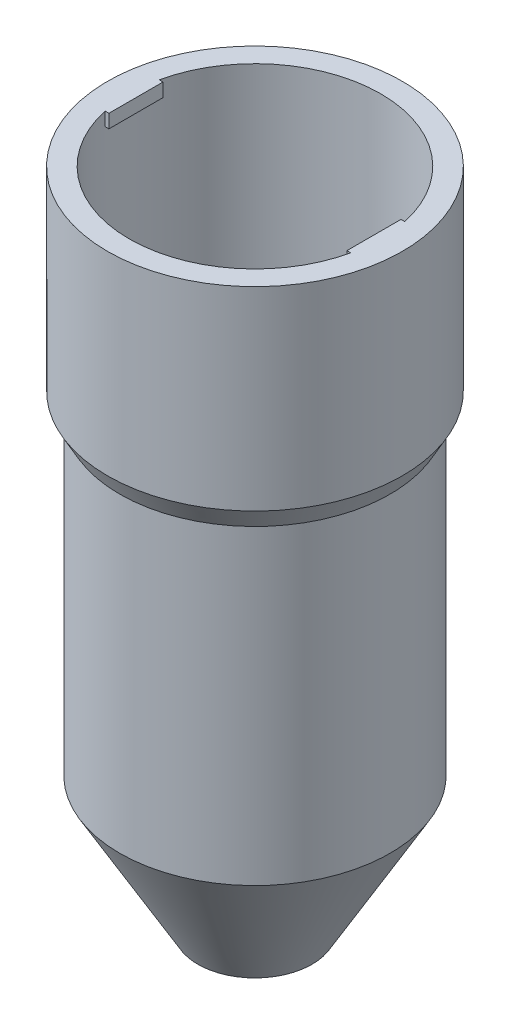
ISO-10303-21;
HEADER;
FILE_DESCRIPTION(('STEP AP214'),'2;1');
FILE_NAME('part.step','',(''),(''),'','','');
FILE_SCHEMA(('AUTOMOTIVE_DESIGN { 1 0 10303 214 1 1 1 1 }'));
ENDSEC;
DATA;
#1=APPLICATION_CONTEXT('core data for automotive mechanical design processes');
#2=APPLICATION_PROTOCOL_DEFINITION('international standard','automotive_design',2000,#1);
#3=PRODUCT_CONTEXT('',#1,'mechanical');
#4=PRODUCT('Part','Part','',(#3));
#5=PRODUCT_RELATED_PRODUCT_CATEGORY('part','',(#4));
#6=PRODUCT_DEFINITION_FORMATION('','',#4);
#7=PRODUCT_DEFINITION_CONTEXT('part definition',#1,'design');
#8=PRODUCT_DEFINITION('design','',#6,#7);
#9=PRODUCT_DEFINITION_SHAPE('','',#8);
#10=(LENGTH_UNIT() NAMED_UNIT(*) SI_UNIT(.MILLI.,.METRE.));
#11=(NAMED_UNIT(*) PLANE_ANGLE_UNIT() SI_UNIT($,.RADIAN.));
#12=(NAMED_UNIT(*) SI_UNIT($,.STERADIAN.) SOLID_ANGLE_UNIT());
#13=UNCERTAINTY_MEASURE_WITH_UNIT(LENGTH_MEASURE(1.E-05),#10,'distance_accuracy_value','');
#14=(GEOMETRIC_REPRESENTATION_CONTEXT(3) GLOBAL_UNCERTAINTY_ASSIGNED_CONTEXT((#13)) GLOBAL_UNIT_ASSIGNED_CONTEXT((#10,
#11,#12)) REPRESENTATION_CONTEXT('',''));
#15=CARTESIAN_POINT('',(0.,0.,0.));
#16=DIRECTION('',(0.,0.,1.));
#17=DIRECTION('',(1.,0.,0.));
#18=AXIS2_PLACEMENT_3D('',#15,#16,#17);
#19=CARTESIAN_POINT('',(0.,16.,0.));
#20=DIRECTION('',(0.,1.,0.));
#21=DIRECTION('',(0.,0.,1.));
#22=AXIS2_PLACEMENT_3D('',#19,#20,#21);
#23=PLANE('',#22);
#24=CARTESIAN_POINT('',(0.,16.,0.));
#25=DIRECTION('',(0.,1.,0.));
#26=DIRECTION('',(0.,0.,1.));
#27=AXIS2_PLACEMENT_3D('',#24,#25,#26);
#28=CIRCLE('',#27,3.75);
#29=CARTESIAN_POINT('',(0.,16.,3.75));
#30=VERTEX_POINT('',#29);
#31=EDGE_CURVE('E174',#30,#30,#28,.F.);
#32=ORIENTED_EDGE('',*,*,#31,.T.);
#33=EDGE_LOOP('',(#32));
#34=FACE_BOUND('',#33,.T.);
#35=CARTESIAN_POINT('',(0.,16.,0.));
#36=DIRECTION('',(0.,1.,0.));
#37=DIRECTION('',(0.,0.,1.));
#38=AXIS2_PLACEMENT_3D('',#35,#36,#37);
#39=CIRCLE('',#38,4.65);
#40=CARTESIAN_POINT('',(0.,16.,4.65));
#41=VERTEX_POINT('',#40);
#42=EDGE_CURVE('E177',#41,#41,#39,.F.);
#43=ORIENTED_EDGE('',*,*,#42,.F.);
#44=EDGE_LOOP('',(#43));
#45=FACE_BOUND('',#44,.T.);
#46=ADVANCED_FACE('F33',(#34,#45),#23,.T.);
#47=CARTESIAN_POINT('',(0.,16.,0.));
#48=DIRECTION('',(0.,-1.,0.));
#49=DIRECTION('',(0.,0.,-1.));
#50=AXIS2_PLACEMENT_3D('',#47,#48,#49);
#51=CYLINDRICAL_SURFACE('',#50,5.);
#52=CARTESIAN_POINT('',(0.,15.,0.));
#53=DIRECTION('',(0.,1.,0.));
#54=DIRECTION('',(0.,0.,1.));
#55=AXIS2_PLACEMENT_3D('',#52,#53,#54);
#56=CIRCLE('',#55,5.);
#57=CARTESIAN_POINT('',(0.,15.,5.));
#58=VERTEX_POINT('',#57);
#59=EDGE_CURVE('E180',#58,#58,#56,.F.);
#60=ORIENTED_EDGE('',*,*,#59,.T.);
#61=EDGE_LOOP('',(#60));
#62=FACE_BOUND('',#61,.T.);
#63=CARTESIAN_POINT('',(0.,3.50000000000004,0.));
#64=DIRECTION('',(0.,-1.,0.));
#65=DIRECTION('',(0.,0.,-1.));
#66=AXIS2_PLACEMENT_3D('',#63,#64,#65);
#67=CIRCLE('',#66,5.);
#68=CARTESIAN_POINT('',(0.,3.50000000000004,-5.));
#69=VERTEX_POINT('',#68);
#70=EDGE_CURVE('E162',#69,#69,#67,.F.);
#71=ORIENTED_EDGE('',*,*,#70,.T.);
#72=EDGE_LOOP('',(#71));
#73=FACE_BOUND('',#72,.T.);
#74=ADVANCED_FACE('F229',(#62,#73),#51,.T.);
#75=CARTESIAN_POINT('',(0.,16.,0.));
#76=DIRECTION('',(0.,-1.,0.));
#77=DIRECTION('',(0.,0.,-1.));
#78=AXIS2_PLACEMENT_3D('',#75,#76,#77);
#79=CYLINDRICAL_SURFACE('',#78,2.75);
#80=CARTESIAN_POINT('',(0.,15.,0.));
#81=DIRECTION('',(0.,1.,0.));
#82=DIRECTION('',(0.,0.,1.));
#83=AXIS2_PLACEMENT_3D('',#80,#81,#82);
#84=CIRCLE('',#83,2.75);
#85=CARTESIAN_POINT('',(0.,15.,2.75));
#86=VERTEX_POINT('',#85);
#87=EDGE_CURVE('E171',#86,#86,#84,.T.);
#88=ORIENTED_EDGE('',*,*,#87,.T.);
#89=EDGE_LOOP('',(#88));
#90=FACE_BOUND('',#89,.T.);
#91=CARTESIAN_POINT('',(0.,1.99999999999999,0.));
#92=DIRECTION('',(0.,-1.,0.));
#93=DIRECTION('',(0.,0.,-1.));
#94=AXIS2_PLACEMENT_3D('',#91,#92,#93);
#95=CIRCLE('',#94,2.75);
#96=CARTESIAN_POINT('',(0.,1.99999999999999,-2.75));
#97=VERTEX_POINT('',#96);
#98=EDGE_CURVE('E168',#97,#97,#95,.T.);
#99=ORIENTED_EDGE('',*,*,#98,.T.);
#100=EDGE_LOOP('',(#99));
#101=FACE_BOUND('',#100,.T.);
#102=ADVANCED_FACE('F235',(#90,#101),#79,.F.);
#103=CARTESIAN_POINT('',(0.,0.,0.));
#104=DIRECTION('',(0.,-1.,0.));
#105=DIRECTION('',(0.,0.,-1.));
#106=AXIS2_PLACEMENT_3D('',#103,#104,#105);
#107=PLANE('',#106);
#108=CARTESIAN_POINT('',(0.,0.,0.));
#109=DIRECTION('',(0.,-1.,0.));
#110=DIRECTION('',(0.,0.,-1.));
#111=AXIS2_PLACEMENT_3D('',#108,#109,#110);
#112=CIRCLE('',#111,1.59529946162074);
#113=CARTESIAN_POINT('',(0.,0.,-1.59529946162074));
#114=VERTEX_POINT('',#113);
#115=EDGE_CURVE('E165',#114,#114,#112,.F.);
#116=ORIENTED_EDGE('',*,*,#115,.T.);
#117=EDGE_LOOP('',(#116));
#118=FACE_BOUND('',#117,.T.);
#119=CARTESIAN_POINT('',(0.,0.,0.));
#120=DIRECTION('',(0.,1.,0.));
#121=DIRECTION('',(0.,0.,1.));
#122=AXIS2_PLACEMENT_3D('',#119,#120,#121);
#123=CIRCLE('',#122,0.75);
#124=CARTESIAN_POINT('',(0.,0.,0.75));
#125=VERTEX_POINT('',#124);
#126=EDGE_CURVE('E153',#125,#125,#123,.T.);
#127=ORIENTED_EDGE('',*,*,#126,.F.);
#128=EDGE_LOOP('',(#127));
#129=FACE_BOUND('',#128,.T.);
#130=ADVANCED_FACE('F264',(#118,#129),#107,.F.);
#131=CARTESIAN_POINT('',(0.,-1.5,0.));
#132=DIRECTION('',(0.,-1.,0.));
#133=DIRECTION('',(0.,0.,-1.));
#134=AXIS2_PLACEMENT_3D('',#131,#132,#133);
#135=PLANE('',#134);
#136=CARTESIAN_POINT('',(0.,-1.5,0.));
#137=DIRECTION('',(0.,-1.,0.));
#138=DIRECTION('',(0.,0.,-1.));
#139=AXIS2_PLACEMENT_3D('',#136,#137,#138);
#140=CIRCLE('',#139,2.11324865405186);
#141=CARTESIAN_POINT('',(0.,-1.5,-2.11324865405186));
#142=VERTEX_POINT('',#141);
#143=EDGE_CURVE('E157',#142,#142,#140,.T.);
#144=ORIENTED_EDGE('',*,*,#143,.T.);
#145=EDGE_LOOP('',(#144));
#146=FACE_BOUND('',#145,.T.);
#147=CARTESIAN_POINT('',(0.,-1.5,0.));
#148=DIRECTION('',(0.,1.,0.));
#149=DIRECTION('',(0.,0.,1.));
#150=AXIS2_PLACEMENT_3D('',#147,#148,#149);
#151=CIRCLE('',#150,0.75);
#152=CARTESIAN_POINT('',(0.,-1.5,0.75));
#153=VERTEX_POINT('',#152);
#154=EDGE_CURVE('E154',#153,#153,#151,.T.);
#155=ORIENTED_EDGE('',*,*,#154,.T.);
#156=EDGE_LOOP('',(#155));
#157=FACE_BOUND('',#156,.T.);
#158=ADVANCED_FACE('F271',(#146,#157),#135,.T.);
#159=CARTESIAN_POINT('',(0.,-1.5,0.));
#160=DIRECTION('',(0.,1.,0.));
#161=DIRECTION('',(0.,0.,1.));
#162=AXIS2_PLACEMENT_3D('',#159,#160,#161);
#163=CYLINDRICAL_SURFACE('',#162,0.75);
#164=ORIENTED_EDGE('',*,*,#154,.F.);
#165=EDGE_LOOP('',(#164));
#166=FACE_BOUND('',#165,.T.);
#167=ORIENTED_EDGE('',*,*,#126,.T.);
#168=EDGE_LOOP('',(#167));
#169=FACE_BOUND('',#168,.T.);
#170=ADVANCED_FACE('F246',(#166,#169),#163,.F.);
#171=CARTESIAN_POINT('',(0.,-1.5,0.));
#172=DIRECTION('',(0.,1.,0.));
#173=DIRECTION('',(0.,0.,1.));
#174=AXIS2_PLACEMENT_3D('',#171,#172,#173);
#175=CONICAL_SURFACE('',#174,2.11324865405186,0.523598775598297);
#176=ORIENTED_EDGE('',*,*,#70,.F.);
#177=EDGE_LOOP('',(#176));
#178=FACE_BOUND('',#177,.T.);
#179=ORIENTED_EDGE('',*,*,#143,.F.);
#180=EDGE_LOOP('',(#179));
#181=FACE_BOUND('',#180,.T.);
#182=ADVANCED_FACE('F242',(#178,#181),#175,.T.);
#183=CARTESIAN_POINT('',(0.,0.,0.));
#184=DIRECTION('',(0.,1.,0.));
#185=DIRECTION('',(0.,0.,1.));
#186=AXIS2_PLACEMENT_3D('',#183,#184,#185);
#187=CONICAL_SURFACE('',#186,1.59529946162074,0.523598775598304);
#188=ORIENTED_EDGE('',*,*,#98,.F.);
#189=EDGE_LOOP('',(#188));
#190=FACE_BOUND('',#189,.T.);
#191=ORIENTED_EDGE('',*,*,#115,.F.);
#192=EDGE_LOOP('',(#191));
#193=FACE_BOUND('',#192,.T.);
#194=ADVANCED_FACE('F245',(#190,#193),#187,.F.);
#195=CARTESIAN_POINT('',(0.,15.,0.));
#196=DIRECTION('',(0.,1.,0.));
#197=DIRECTION('',(0.,0.,1.));
#198=AXIS2_PLACEMENT_3D('',#195,#196,#197);
#199=TOROIDAL_SURFACE('',#198,3.75,1.);
#200=ORIENTED_EDGE('',*,*,#31,.F.);
#201=EDGE_LOOP('',(#200));
#202=FACE_BOUND('',#201,.T.);
#203=ORIENTED_EDGE('',*,*,#87,.F.);
#204=EDGE_LOOP('',(#203));
#205=FACE_BOUND('',#204,.T.);
#206=ADVANCED_FACE('F249',(#202,#205),#199,.T.);
#207=CARTESIAN_POINT('',(0.,23.,0.));
#208=DIRECTION('',(0.,1.,0.));
#209=DIRECTION('',(0.,0.,1.));
#210=AXIS2_PLACEMENT_3D('',#207,#208,#209);
#211=PLANE('',#210);
#212=CARTESIAN_POINT('',(0.,23.,0.));
#213=DIRECTION('',(0.,1.,0.));
#214=DIRECTION('',(0.,0.,1.));
#215=AXIS2_PLACEMENT_3D('',#212,#213,#214);
#216=CIRCLE('',#215,4.65);
#217=CARTESIAN_POINT('',(-4.54120028186382,23.,1.));
#218=VERTEX_POINT('',#217);
#219=CARTESIAN_POINT('',(4.54120028186382,23.,1.));
#220=VERTEX_POINT('',#219);
#221=EDGE_CURVE('E145',#218,#220,#216,.T.);
#222=ORIENTED_EDGE('',*,*,#221,.F.);
#223=DIRECTION('',(1.,0.,0.));
#224=VECTOR('',#223,1.);
#225=CARTESIAN_POINT('',(-4.9,23.,1.));
#226=LINE('',#225,#224);
#227=CARTESIAN_POINT('',(-4.4,23.,1.));
#228=VERTEX_POINT('',#227);
#229=EDGE_CURVE('E117',#218,#228,#226,.T.);
#230=ORIENTED_EDGE('',*,*,#229,.T.);
#231=DIRECTION('',(0.,0.,-1.));
#232=VECTOR('',#231,1.);
#233=CARTESIAN_POINT('',(-4.4,23.,-1.));
#234=LINE('',#233,#232);
#235=CARTESIAN_POINT('',(-4.4,23.,-1.));
#236=VERTEX_POINT('',#235);
#237=EDGE_CURVE('E122',#228,#236,#234,.T.);
#238=ORIENTED_EDGE('',*,*,#237,.T.);
#239=DIRECTION('',(-1.,0.,0.));
#240=VECTOR('',#239,1.);
#241=CARTESIAN_POINT('',(-4.9,23.,-1.));
#242=LINE('',#241,#240);
#243=CARTESIAN_POINT('',(-4.54120028186382,23.,-1.));
#244=VERTEX_POINT('',#243);
#245=EDGE_CURVE('E100',#236,#244,#242,.T.);
#246=ORIENTED_EDGE('',*,*,#245,.T.);
#247=CARTESIAN_POINT('',(4.54120028186382,23.,-1.));
#248=VERTEX_POINT('',#247);
#249=EDGE_CURVE('E148',#248,#244,#216,.T.);
#250=ORIENTED_EDGE('',*,*,#249,.F.);
#251=DIRECTION('',(-1.,0.,0.));
#252=VECTOR('',#251,1.);
#253=CARTESIAN_POINT('',(4.4,23.,-1.));
#254=LINE('',#253,#252);
#255=CARTESIAN_POINT('',(4.4,23.,-1.));
#256=VERTEX_POINT('',#255);
#257=EDGE_CURVE('E125',#248,#256,#254,.T.);
#258=ORIENTED_EDGE('',*,*,#257,.T.);
#259=DIRECTION('',(0.,0.,1.));
#260=VECTOR('',#259,1.);
#261=CARTESIAN_POINT('',(4.4,23.,-1.));
#262=LINE('',#261,#260);
#263=CARTESIAN_POINT('',(4.4,23.,1.));
#264=VERTEX_POINT('',#263);
#265=EDGE_CURVE('E138',#256,#264,#262,.T.);
#266=ORIENTED_EDGE('',*,*,#265,.T.);
#267=DIRECTION('',(1.,0.,0.));
#268=VECTOR('',#267,1.);
#269=CARTESIAN_POINT('',(4.4,23.,1.));
#270=LINE('',#269,#268);
#271=EDGE_CURVE('E130',#264,#220,#270,.T.);
#272=ORIENTED_EDGE('',*,*,#271,.T.);
#273=EDGE_LOOP('',(#222,#230,#238,#246,#250,#258,#266,#272));
#274=FACE_BOUND('',#273,.T.);
#275=CARTESIAN_POINT('',(0.,23.,0.));
#276=DIRECTION('',(0.,1.,0.));
#277=DIRECTION('',(0.,0.,1.));
#278=AXIS2_PLACEMENT_3D('',#275,#276,#277);
#279=CIRCLE('',#278,5.45);
#280=CARTESIAN_POINT('',(0.,23.,5.45));
#281=VERTEX_POINT('',#280);
#282=EDGE_CURVE('E150',#281,#281,#279,.T.);
#283=ORIENTED_EDGE('',*,*,#282,.T.);
#284=EDGE_LOOP('',(#283));
#285=FACE_BOUND('',#284,.T.);
#286=ADVANCED_FACE('F195',(#274,#285),#211,.T.);
#287=CARTESIAN_POINT('',(0.,23.,0.));
#288=DIRECTION('',(0.,-1.,0.));
#289=DIRECTION('',(0.,0.,-1.));
#290=AXIS2_PLACEMENT_3D('',#287,#288,#289);
#291=CYLINDRICAL_SURFACE('',#290,5.45);
#292=CARTESIAN_POINT('',(0.,15.8118214898721,0.));
#293=DIRECTION('',(0.,1.,0.));
#294=DIRECTION('',(0.,0.,1.));
#295=AXIS2_PLACEMENT_3D('',#292,#293,#294);
#296=CIRCLE('',#295,5.45);
#297=CARTESIAN_POINT('',(0.,15.8118214898721,5.45));
#298=VERTEX_POINT('',#297);
#299=EDGE_CURVE('E183',#298,#298,#296,.T.);
#300=ORIENTED_EDGE('',*,*,#299,.T.);
#301=EDGE_LOOP('',(#300));
#302=FACE_BOUND('',#301,.T.);
#303=ORIENTED_EDGE('',*,*,#282,.F.);
#304=EDGE_LOOP('',(#303));
#305=FACE_BOUND('',#304,.T.);
#306=ADVANCED_FACE('F256',(#302,#305),#291,.T.);
#307=CARTESIAN_POINT('',(0.,23.,0.));
#308=DIRECTION('',(0.,-1.,0.));
#309=DIRECTION('',(0.,0.,-1.));
#310=AXIS2_PLACEMENT_3D('',#307,#308,#309);
#311=CYLINDRICAL_SURFACE('',#310,4.65);
#312=DIRECTION('',(0.,-1.,0.));
#313=VECTOR('',#312,1.);
#314=CARTESIAN_POINT('',(-4.54120028186382,23.,1.));
#315=LINE('',#314,#313);
#316=CARTESIAN_POINT('',(-4.54120028186382,22.5,1.));
#317=VERTEX_POINT('',#316);
#318=EDGE_CURVE('E11',#218,#317,#315,.T.);
#319=ORIENTED_EDGE('',*,*,#318,.F.);
#320=ORIENTED_EDGE('',*,*,#221,.T.);
#321=DIRECTION('',(0.,-1.,0.));
#322=VECTOR('',#321,1.);
#323=CARTESIAN_POINT('',(4.54120028186382,23.,1.));
#324=LINE('',#323,#322);
#325=CARTESIAN_POINT('',(4.54120028186382,22.5,1.));
#326=VERTEX_POINT('',#325);
#327=EDGE_CURVE('E191',#326,#220,#324,.F.);
#328=ORIENTED_EDGE('',*,*,#327,.F.);
#329=CARTESIAN_POINT('',(0.,22.5,0.));
#330=DIRECTION('',(0.,1.,0.));
#331=DIRECTION('',(0.,0.,1.));
#332=AXIS2_PLACEMENT_3D('',#329,#330,#331);
#333=CIRCLE('',#332,4.65);
#334=CARTESIAN_POINT('',(4.54120028186382,22.5,-1.));
#335=VERTEX_POINT('',#334);
#336=EDGE_CURVE('E186',#326,#335,#333,.T.);
#337=ORIENTED_EDGE('',*,*,#336,.T.);
#338=DIRECTION('',(0.,-1.,0.));
#339=VECTOR('',#338,1.);
#340=CARTESIAN_POINT('',(4.54120028186382,23.,-1.));
#341=LINE('',#340,#339);
#342=EDGE_CURVE('E188',#248,#335,#341,.T.);
#343=ORIENTED_EDGE('',*,*,#342,.F.);
#344=ORIENTED_EDGE('',*,*,#249,.T.);
#345=DIRECTION('',(0.,-1.,0.));
#346=VECTOR('',#345,1.);
#347=CARTESIAN_POINT('',(-4.54120028186382,23.,-1.));
#348=LINE('',#347,#346);
#349=CARTESIAN_POINT('',(-4.54120028186382,22.5,-1.));
#350=VERTEX_POINT('',#349);
#351=EDGE_CURVE('E41',#350,#244,#348,.F.);
#352=ORIENTED_EDGE('',*,*,#351,.F.);
#353=CARTESIAN_POINT('',(0.,22.5,0.));
#354=DIRECTION('',(0.,1.,0.));
#355=DIRECTION('',(0.,0.,1.));
#356=AXIS2_PLACEMENT_3D('',#353,#354,#355);
#357=CIRCLE('',#356,4.65);
#358=EDGE_CURVE('E48',#350,#317,#357,.T.);
#359=ORIENTED_EDGE('',*,*,#358,.T.);
#360=EDGE_LOOP('',(#319,#320,#328,#337,#343,#344,#352,#359));
#361=FACE_BOUND('',#360,.T.);
#362=ORIENTED_EDGE('',*,*,#42,.T.);
#363=EDGE_LOOP('',(#362));
#364=FACE_BOUND('',#363,.T.);
#365=ADVANCED_FACE('F201',(#361,#364),#311,.F.);
#366=CARTESIAN_POINT('',(0.,16.,0.));
#367=DIRECTION('',(0.,1.,0.));
#368=DIRECTION('',(0.,0.,1.));
#369=AXIS2_PLACEMENT_3D('',#366,#367,#368);
#370=CONICAL_SURFACE('',#369,5.55430905145278,0.506145483078362);
#371=ORIENTED_EDGE('',*,*,#59,.F.);
#372=EDGE_LOOP('',(#371));
#373=FACE_BOUND('',#372,.T.);
#374=ORIENTED_EDGE('',*,*,#299,.F.);
#375=EDGE_LOOP('',(#374));
#376=FACE_BOUND('',#375,.T.);
#377=ADVANCED_FACE('F35',(#373,#376),#370,.T.);
#378=CARTESIAN_POINT('',(0.,22.5,0.));
#379=DIRECTION('',(0.,1.,0.));
#380=DIRECTION('',(0.,0.,1.));
#381=AXIS2_PLACEMENT_3D('',#378,#379,#380);
#382=PLANE('',#381);
#383=ORIENTED_EDGE('',*,*,#336,.F.);
#384=DIRECTION('',(1.,0.,0.));
#385=VECTOR('',#384,1.);
#386=CARTESIAN_POINT('',(4.4,22.5,1.));
#387=LINE('',#386,#385);
#388=CARTESIAN_POINT('',(4.4,22.5,1.));
#389=VERTEX_POINT('',#388);
#390=EDGE_CURVE('E133',#389,#326,#387,.T.);
#391=ORIENTED_EDGE('',*,*,#390,.F.);
#392=DIRECTION('',(0.,0.,1.));
#393=VECTOR('',#392,1.);
#394=CARTESIAN_POINT('',(4.4,22.5,-1.));
#395=LINE('',#394,#393);
#396=CARTESIAN_POINT('',(4.4,22.5,-1.));
#397=VERTEX_POINT('',#396);
#398=EDGE_CURVE('E129',#397,#389,#395,.T.);
#399=ORIENTED_EDGE('',*,*,#398,.F.);
#400=DIRECTION('',(-1.,0.,0.));
#401=VECTOR('',#400,1.);
#402=CARTESIAN_POINT('',(4.4,22.5,-1.));
#403=LINE('',#402,#401);
#404=EDGE_CURVE('E127',#335,#397,#403,.T.);
#405=ORIENTED_EDGE('',*,*,#404,.F.);
#406=EDGE_LOOP('',(#383,#391,#399,#405));
#407=FACE_BOUND('',#406,.T.);
#408=ADVANCED_FACE('F216',(#407),#382,.F.);
#409=CARTESIAN_POINT('',(4.4,22.5,1.));
#410=DIRECTION('',(0.,0.,1.));
#411=DIRECTION('',(1.,0.,0.));
#412=AXIS2_PLACEMENT_3D('',#409,#410,#411);
#413=PLANE('',#412);
#414=ORIENTED_EDGE('',*,*,#390,.T.);
#415=ORIENTED_EDGE('',*,*,#327,.T.);
#416=ORIENTED_EDGE('',*,*,#271,.F.);
#417=DIRECTION('',(0.,1.,0.));
#418=VECTOR('',#417,1.);
#419=CARTESIAN_POINT('',(4.4,22.5,1.));
#420=LINE('',#419,#418);
#421=EDGE_CURVE('E143',#389,#264,#420,.T.);
#422=ORIENTED_EDGE('',*,*,#421,.F.);
#423=EDGE_LOOP('',(#414,#415,#416,#422));
#424=FACE_BOUND('',#423,.T.);
#425=ADVANCED_FACE('F206',(#424),#413,.T.);
#426=CARTESIAN_POINT('',(4.4,22.5,-1.));
#427=DIRECTION('',(-1.,0.,0.));
#428=DIRECTION('',(0.,0.,1.));
#429=AXIS2_PLACEMENT_3D('',#426,#427,#428);
#430=PLANE('',#429);
#431=ORIENTED_EDGE('',*,*,#265,.F.);
#432=DIRECTION('',(0.,1.,0.));
#433=VECTOR('',#432,1.);
#434=CARTESIAN_POINT('',(4.4,22.5,-1.));
#435=LINE('',#434,#433);
#436=EDGE_CURVE('E136',#397,#256,#435,.T.);
#437=ORIENTED_EDGE('',*,*,#436,.F.);
#438=ORIENTED_EDGE('',*,*,#398,.T.);
#439=ORIENTED_EDGE('',*,*,#421,.T.);
#440=EDGE_LOOP('',(#431,#437,#438,#439));
#441=FACE_BOUND('',#440,.T.);
#442=ADVANCED_FACE('F212',(#441),#430,.T.);
#443=CARTESIAN_POINT('',(4.4,22.5,-1.));
#444=DIRECTION('',(0.,0.,-1.));
#445=DIRECTION('',(-1.,0.,0.));
#446=AXIS2_PLACEMENT_3D('',#443,#444,#445);
#447=PLANE('',#446);
#448=ORIENTED_EDGE('',*,*,#257,.F.);
#449=ORIENTED_EDGE('',*,*,#342,.T.);
#450=ORIENTED_EDGE('',*,*,#404,.T.);
#451=ORIENTED_EDGE('',*,*,#436,.T.);
#452=EDGE_LOOP('',(#448,#449,#450,#451));
#453=FACE_BOUND('',#452,.T.);
#454=ADVANCED_FACE('F218',(#453),#447,.T.);
#455=CARTESIAN_POINT('',(0.,22.5,0.));
#456=DIRECTION('',(0.,1.,0.));
#457=DIRECTION('',(0.,0.,1.));
#458=AXIS2_PLACEMENT_3D('',#455,#456,#457);
#459=PLANE('',#458);
#460=ORIENTED_EDGE('',*,*,#358,.F.);
#461=DIRECTION('',(-1.,0.,0.));
#462=VECTOR('',#461,1.);
#463=CARTESIAN_POINT('',(-4.9,22.5,-1.));
#464=LINE('',#463,#462);
#465=CARTESIAN_POINT('',(-4.4,22.5,-1.));
#466=VERTEX_POINT('',#465);
#467=EDGE_CURVE('E98',#466,#350,#464,.T.);
#468=ORIENTED_EDGE('',*,*,#467,.F.);
#469=DIRECTION('',(0.,0.,-1.));
#470=VECTOR('',#469,1.);
#471=CARTESIAN_POINT('',(-4.4,22.5,-1.));
#472=LINE('',#471,#470);
#473=CARTESIAN_POINT('',(-4.4,22.5,1.));
#474=VERTEX_POINT('',#473);
#475=EDGE_CURVE('E112',#474,#466,#472,.T.);
#476=ORIENTED_EDGE('',*,*,#475,.F.);
#477=DIRECTION('',(1.,0.,0.));
#478=VECTOR('',#477,1.);
#479=CARTESIAN_POINT('',(-4.9,22.5,1.));
#480=LINE('',#479,#478);
#481=EDGE_CURVE('E106',#317,#474,#480,.T.);
#482=ORIENTED_EDGE('',*,*,#481,.F.);
#483=EDGE_LOOP('',(#460,#468,#476,#482));
#484=FACE_BOUND('',#483,.T.);
#485=ADVANCED_FACE('F110',(#484),#459,.F.);
#486=CARTESIAN_POINT('',(-4.4,22.5,-1.));
#487=DIRECTION('',(1.,0.,0.));
#488=DIRECTION('',(0.,0.,-1.));
#489=AXIS2_PLACEMENT_3D('',#486,#487,#488);
#490=PLANE('',#489);
#491=ORIENTED_EDGE('',*,*,#237,.F.);
#492=DIRECTION('',(0.,1.,0.));
#493=VECTOR('',#492,1.);
#494=CARTESIAN_POINT('',(-4.4,22.5,1.));
#495=LINE('',#494,#493);
#496=EDGE_CURVE('E105',#474,#228,#495,.T.);
#497=ORIENTED_EDGE('',*,*,#496,.F.);
#498=ORIENTED_EDGE('',*,*,#475,.T.);
#499=DIRECTION('',(0.,1.,0.));
#500=VECTOR('',#499,1.);
#501=CARTESIAN_POINT('',(-4.4,22.5,-1.));
#502=LINE('',#501,#500);
#503=EDGE_CURVE('E95',#466,#236,#502,.T.);
#504=ORIENTED_EDGE('',*,*,#503,.T.);
#505=EDGE_LOOP('',(#491,#497,#498,#504));
#506=FACE_BOUND('',#505,.T.);
#507=ADVANCED_FACE('F115',(#506),#490,.T.);
#508=CARTESIAN_POINT('',(-4.9,22.5,1.));
#509=DIRECTION('',(0.,0.,1.));
#510=DIRECTION('',(1.,0.,0.));
#511=AXIS2_PLACEMENT_3D('',#508,#509,#510);
#512=PLANE('',#511);
#513=ORIENTED_EDGE('',*,*,#229,.F.);
#514=ORIENTED_EDGE('',*,*,#318,.T.);
#515=ORIENTED_EDGE('',*,*,#481,.T.);
#516=ORIENTED_EDGE('',*,*,#496,.T.);
#517=EDGE_LOOP('',(#513,#514,#515,#516));
#518=FACE_BOUND('',#517,.T.);
#519=ADVANCED_FACE('F200',(#518),#512,.T.);
#520=CARTESIAN_POINT('',(-4.9,22.5,-1.));
#521=DIRECTION('',(0.,0.,-1.));
#522=DIRECTION('',(-1.,0.,0.));
#523=AXIS2_PLACEMENT_3D('',#520,#521,#522);
#524=PLANE('',#523);
#525=ORIENTED_EDGE('',*,*,#467,.T.);
#526=ORIENTED_EDGE('',*,*,#351,.T.);
#527=ORIENTED_EDGE('',*,*,#245,.F.);
#528=ORIENTED_EDGE('',*,*,#503,.F.);
#529=EDGE_LOOP('',(#525,#526,#527,#528));
#530=FACE_BOUND('',#529,.T.);
#531=ADVANCED_FACE('F97',(#530),#524,.T.);
#532=CLOSED_SHELL('',(#46,#74,#102,#130,#158,#170,#182,#194,#206,#286,#306,#365,#377,#408,#425,
#442,#454,#485,#507,#519,#531));
#533=MANIFOLD_SOLID_BREP('B2',#532);
#534=ADVANCED_BREP_SHAPE_REPRESENTATION('',(#18,#533),#14);
#535=SHAPE_DEFINITION_REPRESENTATION(#9,#534);
ENDSEC;
END-ISO-10303-21;
